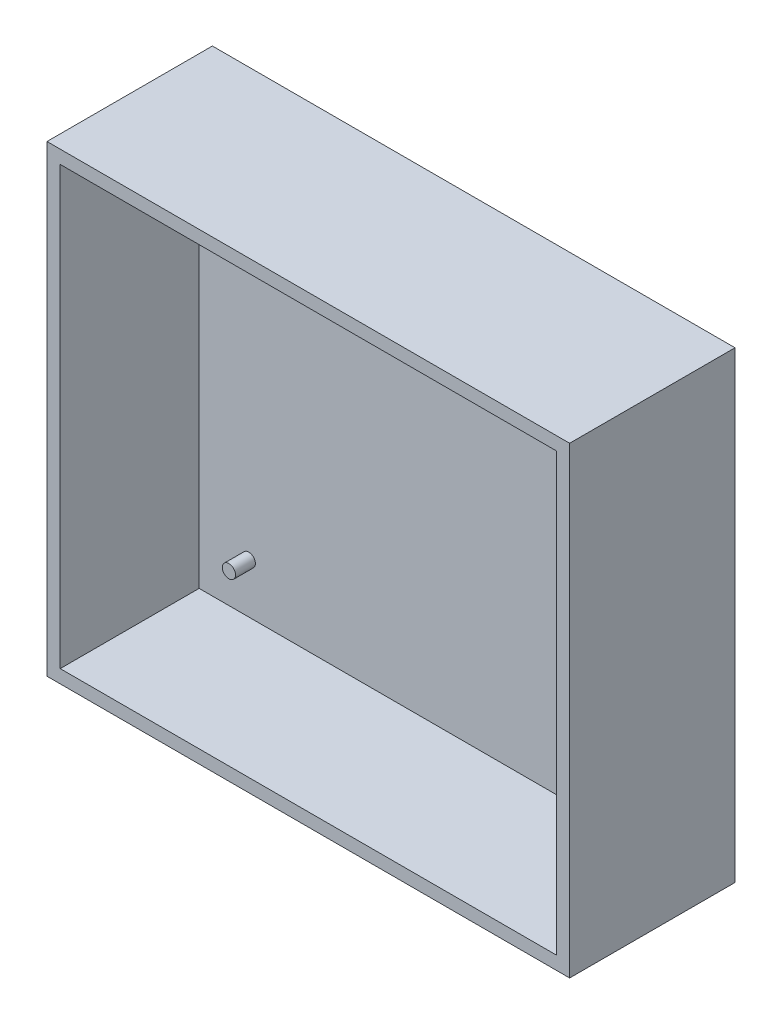
ISO-10303-21;
HEADER;
FILE_DESCRIPTION(('STEP AP214'),'2;1');
FILE_NAME('part.step','',(''),(''),'','','');
FILE_SCHEMA(('AUTOMOTIVE_DESIGN { 1 0 10303 214 1 1 1 1 }'));
ENDSEC;
DATA;
#1=APPLICATION_CONTEXT('core data for automotive mechanical design processes');
#2=APPLICATION_PROTOCOL_DEFINITION('international standard','automotive_design',2000,#1);
#3=PRODUCT_CONTEXT('',#1,'mechanical');
#4=PRODUCT('Part','Part','',(#3));
#5=PRODUCT_RELATED_PRODUCT_CATEGORY('part','',(#4));
#6=PRODUCT_DEFINITION_FORMATION('','',#4);
#7=PRODUCT_DEFINITION_CONTEXT('part definition',#1,'design');
#8=PRODUCT_DEFINITION('design','',#6,#7);
#9=PRODUCT_DEFINITION_SHAPE('','',#8);
#10=(LENGTH_UNIT() NAMED_UNIT(*) SI_UNIT(.MILLI.,.METRE.));
#11=(NAMED_UNIT(*) PLANE_ANGLE_UNIT() SI_UNIT($,.RADIAN.));
#12=(NAMED_UNIT(*) SI_UNIT($,.STERADIAN.) SOLID_ANGLE_UNIT());
#13=UNCERTAINTY_MEASURE_WITH_UNIT(LENGTH_MEASURE(1.E-05),#10,'distance_accuracy_value','');
#14=(GEOMETRIC_REPRESENTATION_CONTEXT(3) GLOBAL_UNCERTAINTY_ASSIGNED_CONTEXT((#13)) GLOBAL_UNIT_ASSIGNED_CONTEXT((#10,
#11,#12)) REPRESENTATION_CONTEXT('',''));
#15=CARTESIAN_POINT('',(0.,0.,0.));
#16=DIRECTION('',(0.,0.,1.));
#17=DIRECTION('',(1.,0.,0.));
#18=AXIS2_PLACEMENT_3D('',#15,#16,#17);
#19=CARTESIAN_POINT('',(0.,0.,4.));
#20=DIRECTION('',(0.,0.,-1.));
#21=DIRECTION('',(-1.,0.,0.));
#22=AXIS2_PLACEMENT_3D('',#19,#20,#21);
#23=PLANE('',#22);
#24=CARTESIAN_POINT('',(7.49999999999999,7.5,4.));
#25=DIRECTION('',(0.,0.,-1.));
#26=DIRECTION('',(-1.,0.,0.));
#27=AXIS2_PLACEMENT_3D('',#24,#25,#26);
#28=CIRCLE('',#27,0.999999999999998);
#29=CARTESIAN_POINT('',(6.49999999999999,7.5,4.));
#30=VERTEX_POINT('',#29);
#31=EDGE_CURVE('E11',#30,#30,#28,.F.);
#32=ORIENTED_EDGE('',*,*,#31,.F.);
#33=EDGE_LOOP('',(#32));
#34=FACE_BOUND('',#33,.T.);
#35=CARTESIAN_POINT('',(7.49999999999999,58.5,4.));
#36=DIRECTION('',(0.,0.,-1.));
#37=DIRECTION('',(-1.,0.,0.));
#38=AXIS2_PLACEMENT_3D('',#35,#36,#37);
#39=CIRCLE('',#38,0.999999999999998);
#40=CARTESIAN_POINT('',(6.49999999999999,58.5,4.));
#41=VERTEX_POINT('',#40);
#42=EDGE_CURVE('E41',#41,#41,#39,.F.);
#43=ORIENTED_EDGE('',*,*,#42,.F.);
#44=EDGE_LOOP('',(#43));
#45=FACE_BOUND('',#44,.T.);
#46=CARTESIAN_POINT('',(67.5,58.5,4.));
#47=DIRECTION('',(0.,0.,-1.));
#48=DIRECTION('',(-1.,0.,0.));
#49=AXIS2_PLACEMENT_3D('',#46,#47,#48);
#50=CIRCLE('',#49,0.999999999999998);
#51=CARTESIAN_POINT('',(66.5,58.5,4.));
#52=VERTEX_POINT('',#51);
#53=EDGE_CURVE('E183',#52,#52,#50,.F.);
#54=ORIENTED_EDGE('',*,*,#53,.F.);
#55=EDGE_LOOP('',(#54));
#56=FACE_BOUND('',#55,.T.);
#57=CARTESIAN_POINT('',(67.5,7.5,4.));
#58=DIRECTION('',(0.,0.,-1.));
#59=DIRECTION('',(-1.,0.,0.));
#60=AXIS2_PLACEMENT_3D('',#57,#58,#59);
#61=CIRCLE('',#60,0.999999999999998);
#62=CARTESIAN_POINT('',(66.5,7.5,4.));
#63=VERTEX_POINT('',#62);
#64=EDGE_CURVE('E180',#63,#63,#61,.F.);
#65=ORIENTED_EDGE('',*,*,#64,.F.);
#66=EDGE_LOOP('',(#65));
#67=FACE_BOUND('',#66,.T.);
#68=DIRECTION('',(0.,-1.,0.));
#69=VECTOR('',#68,1.);
#70=CARTESIAN_POINT('',(0.,0.,4.));
#71=LINE('',#70,#69);
#72=CARTESIAN_POINT('',(0.,66.,4.));
#73=VERTEX_POINT('',#72);
#74=CARTESIAN_POINT('',(0.,0.,4.));
#75=VERTEX_POINT('',#74);
#76=EDGE_CURVE('E173',#73,#75,#71,.T.);
#77=ORIENTED_EDGE('',*,*,#76,.T.);
#78=DIRECTION('',(1.,0.,0.));
#79=VECTOR('',#78,1.);
#80=CARTESIAN_POINT('',(0.,0.,4.));
#81=LINE('',#80,#79);
#82=CARTESIAN_POINT('',(75.,0.,4.));
#83=VERTEX_POINT('',#82);
#84=EDGE_CURVE('E103',#75,#83,#81,.T.);
#85=ORIENTED_EDGE('',*,*,#84,.T.);
#86=DIRECTION('',(0.,1.,0.));
#87=VECTOR('',#86,1.);
#88=CARTESIAN_POINT('',(75.,0.,4.));
#89=LINE('',#88,#87);
#90=CARTESIAN_POINT('',(75.,66.,4.));
#91=VERTEX_POINT('',#90);
#92=EDGE_CURVE('E56',#83,#91,#89,.T.);
#93=ORIENTED_EDGE('',*,*,#92,.T.);
#94=DIRECTION('',(-1.,0.,0.));
#95=VECTOR('',#94,1.);
#96=CARTESIAN_POINT('',(0.,66.,4.));
#97=LINE('',#96,#95);
#98=EDGE_CURVE('E177',#91,#73,#97,.T.);
#99=ORIENTED_EDGE('',*,*,#98,.T.);
#100=EDGE_LOOP('',(#77,#85,#93,#99));
#101=FACE_BOUND('',#100,.T.);
#102=ADVANCED_FACE('F33',(#34,#45,#56,#67,#101),#23,.F.);
#103=CARTESIAN_POINT('',(67.5,7.5,7.));
#104=DIRECTION('',(0.,0.,-1.));
#105=DIRECTION('',(-1.,0.,0.));
#106=AXIS2_PLACEMENT_3D('',#103,#104,#105);
#107=CYLINDRICAL_SURFACE('',#106,0.999999999999998);
#108=CARTESIAN_POINT('',(67.5,7.5,7.));
#109=DIRECTION('',(0.,0.,1.));
#110=DIRECTION('',(1.,0.,0.));
#111=AXIS2_PLACEMENT_3D('',#108,#109,#110);
#112=CIRCLE('',#111,0.999999999999998);
#113=CARTESIAN_POINT('',(68.5,7.5,7.));
#114=VERTEX_POINT('',#113);
#115=EDGE_CURVE('E170',#114,#114,#112,.T.);
#116=ORIENTED_EDGE('',*,*,#115,.F.);
#117=EDGE_LOOP('',(#116));
#118=FACE_BOUND('',#117,.T.);
#119=ORIENTED_EDGE('',*,*,#64,.T.);
#120=EDGE_LOOP('',(#119));
#121=FACE_BOUND('',#120,.T.);
#122=ADVANCED_FACE('F192',(#118,#121),#107,.T.);
#123=CARTESIAN_POINT('',(67.5,7.5,7.));
#124=DIRECTION('',(0.,0.,1.));
#125=DIRECTION('',(1.,0.,0.));
#126=AXIS2_PLACEMENT_3D('',#123,#124,#125);
#127=PLANE('',#126);
#128=ORIENTED_EDGE('',*,*,#115,.T.);
#129=EDGE_LOOP('',(#128));
#130=FACE_BOUND('',#129,.T.);
#131=ADVANCED_FACE('F252',(#130),#127,.T.);
#132=CARTESIAN_POINT('',(67.5,58.5,7.));
#133=DIRECTION('',(0.,0.,-1.));
#134=DIRECTION('',(-1.,0.,0.));
#135=AXIS2_PLACEMENT_3D('',#132,#133,#134);
#136=CYLINDRICAL_SURFACE('',#135,0.999999999999998);
#137=CARTESIAN_POINT('',(67.5,58.5,7.));
#138=DIRECTION('',(0.,0.,1.));
#139=DIRECTION('',(-1.,0.,0.));
#140=AXIS2_PLACEMENT_3D('',#137,#138,#139);
#141=CIRCLE('',#140,0.999999999999998);
#142=CARTESIAN_POINT('',(66.5,58.5,7.));
#143=VERTEX_POINT('',#142);
#144=EDGE_CURVE('E167',#143,#143,#141,.T.);
#145=ORIENTED_EDGE('',*,*,#144,.F.);
#146=EDGE_LOOP('',(#145));
#147=FACE_BOUND('',#146,.T.);
#148=ORIENTED_EDGE('',*,*,#53,.T.);
#149=EDGE_LOOP('',(#148));
#150=FACE_BOUND('',#149,.T.);
#151=ADVANCED_FACE('F248',(#147,#150),#136,.T.);
#152=CARTESIAN_POINT('',(67.5,58.5,7.));
#153=DIRECTION('',(0.,0.,-1.));
#154=DIRECTION('',(-1.,0.,0.));
#155=AXIS2_PLACEMENT_3D('',#152,#153,#154);
#156=PLANE('',#155);
#157=ORIENTED_EDGE('',*,*,#144,.T.);
#158=EDGE_LOOP('',(#157));
#159=FACE_BOUND('',#158,.T.);
#160=ADVANCED_FACE('F244',(#159),#156,.F.);
#161=CARTESIAN_POINT('',(7.49999999999999,58.5,7.));
#162=DIRECTION('',(0.,0.,-1.));
#163=DIRECTION('',(-1.,0.,0.));
#164=AXIS2_PLACEMENT_3D('',#161,#162,#163);
#165=CYLINDRICAL_SURFACE('',#164,0.999999999999998);
#166=CARTESIAN_POINT('',(7.49999999999999,58.5,7.));
#167=DIRECTION('',(0.,0.,1.));
#168=DIRECTION('',(1.,0.,0.));
#169=AXIS2_PLACEMENT_3D('',#166,#167,#168);
#170=CIRCLE('',#169,0.999999999999998);
#171=CARTESIAN_POINT('',(8.49999999999999,58.5,7.));
#172=VERTEX_POINT('',#171);
#173=EDGE_CURVE('E164',#172,#172,#170,.T.);
#174=ORIENTED_EDGE('',*,*,#173,.F.);
#175=EDGE_LOOP('',(#174));
#176=FACE_BOUND('',#175,.T.);
#177=ORIENTED_EDGE('',*,*,#42,.T.);
#178=EDGE_LOOP('',(#177));
#179=FACE_BOUND('',#178,.T.);
#180=ADVANCED_FACE('F188',(#176,#179),#165,.T.);
#181=CARTESIAN_POINT('',(7.49999999999999,58.5,7.));
#182=DIRECTION('',(0.,0.,1.));
#183=DIRECTION('',(1.,0.,0.));
#184=AXIS2_PLACEMENT_3D('',#181,#182,#183);
#185=PLANE('',#184);
#186=ORIENTED_EDGE('',*,*,#173,.T.);
#187=EDGE_LOOP('',(#186));
#188=FACE_BOUND('',#187,.T.);
#189=ADVANCED_FACE('F237',(#188),#185,.T.);
#190=CARTESIAN_POINT('',(7.49999999999999,7.5,7.));
#191=DIRECTION('',(0.,0.,-1.));
#192=DIRECTION('',(-1.,0.,0.));
#193=AXIS2_PLACEMENT_3D('',#190,#191,#192);
#194=CYLINDRICAL_SURFACE('',#193,0.999999999999998);
#195=CARTESIAN_POINT('',(7.49999999999999,7.5,7.));
#196=DIRECTION('',(0.,0.,1.));
#197=DIRECTION('',(-1.,0.,0.));
#198=AXIS2_PLACEMENT_3D('',#195,#196,#197);
#199=CIRCLE('',#198,0.999999999999998);
#200=CARTESIAN_POINT('',(6.49999999999999,7.5,7.));
#201=VERTEX_POINT('',#200);
#202=EDGE_CURVE('E156',#201,#201,#199,.T.);
#203=ORIENTED_EDGE('',*,*,#202,.F.);
#204=EDGE_LOOP('',(#203));
#205=FACE_BOUND('',#204,.T.);
#206=ORIENTED_EDGE('',*,*,#31,.T.);
#207=EDGE_LOOP('',(#206));
#208=FACE_BOUND('',#207,.T.);
#209=ADVANCED_FACE('F233',(#205,#208),#194,.T.);
#210=CARTESIAN_POINT('',(7.49999999999999,7.5,7.));
#211=DIRECTION('',(0.,0.,-1.));
#212=DIRECTION('',(-1.,0.,0.));
#213=AXIS2_PLACEMENT_3D('',#210,#211,#212);
#214=PLANE('',#213);
#215=ORIENTED_EDGE('',*,*,#202,.T.);
#216=EDGE_LOOP('',(#215));
#217=FACE_BOUND('',#216,.T.);
#218=ADVANCED_FACE('F208',(#217),#214,.F.);
#219=CARTESIAN_POINT('',(75.,0.,25.));
#220=DIRECTION('',(0.,-1.,0.));
#221=DIRECTION('',(0.,0.,-1.));
#222=AXIS2_PLACEMENT_3D('',#219,#220,#221);
#223=PLANE('',#222);
#224=DIRECTION('',(0.,0.,-1.));
#225=VECTOR('',#224,1.);
#226=CARTESIAN_POINT('',(75.,0.,25.));
#227=LINE('',#226,#225);
#228=CARTESIAN_POINT('',(75.,0.,25.));
#229=VERTEX_POINT('',#228);
#230=EDGE_CURVE('E124',#229,#83,#227,.T.);
#231=ORIENTED_EDGE('',*,*,#230,.T.);
#232=ORIENTED_EDGE('',*,*,#84,.F.);
#233=DIRECTION('',(0.,0.,-1.));
#234=VECTOR('',#233,1.);
#235=CARTESIAN_POINT('',(0.,0.,25.));
#236=LINE('',#235,#234);
#237=CARTESIAN_POINT('',(0.,0.,25.));
#238=VERTEX_POINT('',#237);
#239=EDGE_CURVE('E48',#238,#75,#236,.T.);
#240=ORIENTED_EDGE('',*,*,#239,.F.);
#241=DIRECTION('',(-1.,0.,0.));
#242=VECTOR('',#241,1.);
#243=CARTESIAN_POINT('',(75.,0.,25.));
#244=LINE('',#243,#242);
#245=EDGE_CURVE('E100',#229,#238,#244,.T.);
#246=ORIENTED_EDGE('',*,*,#245,.F.);
#247=EDGE_LOOP('',(#231,#232,#240,#246));
#248=FACE_BOUND('',#247,.T.);
#249=ADVANCED_FACE('F98',(#248),#223,.F.);
#250=CARTESIAN_POINT('',(75.,66.,25.));
#251=DIRECTION('',(1.,0.,0.));
#252=DIRECTION('',(0.,0.,-1.));
#253=AXIS2_PLACEMENT_3D('',#250,#251,#252);
#254=PLANE('',#253);
#255=DIRECTION('',(0.,0.,-1.));
#256=VECTOR('',#255,1.);
#257=CARTESIAN_POINT('',(75.,66.,25.));
#258=LINE('',#257,#256);
#259=CARTESIAN_POINT('',(75.,66.,25.));
#260=VERTEX_POINT('',#259);
#261=EDGE_CURVE('E127',#260,#91,#258,.T.);
#262=ORIENTED_EDGE('',*,*,#261,.T.);
#263=ORIENTED_EDGE('',*,*,#92,.F.);
#264=ORIENTED_EDGE('',*,*,#230,.F.);
#265=DIRECTION('',(0.,-1.,0.));
#266=VECTOR('',#265,1.);
#267=CARTESIAN_POINT('',(75.,66.,25.));
#268=LINE('',#267,#266);
#269=EDGE_CURVE('E106',#260,#229,#268,.T.);
#270=ORIENTED_EDGE('',*,*,#269,.F.);
#271=EDGE_LOOP('',(#262,#263,#264,#270));
#272=FACE_BOUND('',#271,.T.);
#273=ADVANCED_FACE('F200',(#272),#254,.F.);
#274=CARTESIAN_POINT('',(0.,66.,25.));
#275=DIRECTION('',(0.,1.,0.));
#276=DIRECTION('',(0.,0.,1.));
#277=AXIS2_PLACEMENT_3D('',#274,#275,#276);
#278=PLANE('',#277);
#279=DIRECTION('',(0.,0.,-1.));
#280=VECTOR('',#279,1.);
#281=CARTESIAN_POINT('',(0.,66.,25.));
#282=LINE('',#281,#280);
#283=CARTESIAN_POINT('',(0.,66.,25.));
#284=VERTEX_POINT('',#283);
#285=EDGE_CURVE('E105',#284,#73,#282,.T.);
#286=ORIENTED_EDGE('',*,*,#285,.T.);
#287=ORIENTED_EDGE('',*,*,#98,.F.);
#288=ORIENTED_EDGE('',*,*,#261,.F.);
#289=DIRECTION('',(1.,0.,0.));
#290=VECTOR('',#289,1.);
#291=CARTESIAN_POINT('',(0.,66.,25.));
#292=LINE('',#291,#290);
#293=EDGE_CURVE('E115',#284,#260,#292,.T.);
#294=ORIENTED_EDGE('',*,*,#293,.F.);
#295=EDGE_LOOP('',(#286,#287,#288,#294));
#296=FACE_BOUND('',#295,.T.);
#297=ADVANCED_FACE('F199',(#296),#278,.F.);
#298=CARTESIAN_POINT('',(0.,0.,25.));
#299=DIRECTION('',(-1.,0.,0.));
#300=DIRECTION('',(0.,0.,1.));
#301=AXIS2_PLACEMENT_3D('',#298,#299,#300);
#302=PLANE('',#301);
#303=ORIENTED_EDGE('',*,*,#239,.T.);
#304=ORIENTED_EDGE('',*,*,#76,.F.);
#305=ORIENTED_EDGE('',*,*,#285,.F.);
#306=DIRECTION('',(0.,1.,0.));
#307=VECTOR('',#306,1.);
#308=CARTESIAN_POINT('',(0.,0.,25.));
#309=LINE('',#308,#307);
#310=EDGE_CURVE('E110',#238,#284,#309,.T.);
#311=ORIENTED_EDGE('',*,*,#310,.F.);
#312=EDGE_LOOP('',(#303,#304,#305,#311));
#313=FACE_BOUND('',#312,.T.);
#314=ADVANCED_FACE('F111',(#313),#302,.F.);
#315=CARTESIAN_POINT('',(77.,-2.,25.));
#316=DIRECTION('',(0.,-1.,0.));
#317=DIRECTION('',(0.,0.,-1.));
#318=AXIS2_PLACEMENT_3D('',#315,#316,#317);
#319=PLANE('',#318);
#320=DIRECTION('',(-1.,0.,0.));
#321=VECTOR('',#320,1.);
#322=CARTESIAN_POINT('',(77.,-2.,0.));
#323=LINE('',#322,#321);
#324=CARTESIAN_POINT('',(77.,-2.,0.));
#325=VERTEX_POINT('',#324);
#326=CARTESIAN_POINT('',(-2.,-2.,0.));
#327=VERTEX_POINT('',#326);
#328=EDGE_CURVE('E126',#325,#327,#323,.T.);
#329=ORIENTED_EDGE('',*,*,#328,.F.);
#330=DIRECTION('',(0.,0.,-1.));
#331=VECTOR('',#330,1.);
#332=CARTESIAN_POINT('',(77.,-2.,25.));
#333=LINE('',#332,#331);
#334=CARTESIAN_POINT('',(77.,-2.,25.));
#335=VERTEX_POINT('',#334);
#336=EDGE_CURVE('E154',#335,#325,#333,.T.);
#337=ORIENTED_EDGE('',*,*,#336,.F.);
#338=DIRECTION('',(-1.,0.,0.));
#339=VECTOR('',#338,1.);
#340=CARTESIAN_POINT('',(77.,-2.,25.));
#341=LINE('',#340,#339);
#342=CARTESIAN_POINT('',(-2.,-2.,25.));
#343=VERTEX_POINT('',#342);
#344=EDGE_CURVE('E130',#335,#343,#341,.T.);
#345=ORIENTED_EDGE('',*,*,#344,.T.);
#346=DIRECTION('',(0.,0.,-1.));
#347=VECTOR('',#346,1.);
#348=CARTESIAN_POINT('',(-2.,-2.,25.));
#349=LINE('',#348,#347);
#350=EDGE_CURVE('E143',#343,#327,#349,.T.);
#351=ORIENTED_EDGE('',*,*,#350,.T.);
#352=EDGE_LOOP('',(#329,#337,#345,#351));
#353=FACE_BOUND('',#352,.T.);
#354=ADVANCED_FACE('F212',(#353),#319,.T.);
#355=CARTESIAN_POINT('',(77.,68.,25.));
#356=DIRECTION('',(1.,0.,0.));
#357=DIRECTION('',(0.,0.,-1.));
#358=AXIS2_PLACEMENT_3D('',#355,#356,#357);
#359=PLANE('',#358);
#360=DIRECTION('',(0.,-1.,0.));
#361=VECTOR('',#360,1.);
#362=CARTESIAN_POINT('',(77.,68.,0.));
#363=LINE('',#362,#361);
#364=CARTESIAN_POINT('',(77.,68.,0.));
#365=VERTEX_POINT('',#364);
#366=EDGE_CURVE('E134',#365,#325,#363,.T.);
#367=ORIENTED_EDGE('',*,*,#366,.F.);
#368=DIRECTION('',(0.,0.,-1.));
#369=VECTOR('',#368,1.);
#370=CARTESIAN_POINT('',(77.,68.,25.));
#371=LINE('',#370,#369);
#372=CARTESIAN_POINT('',(77.,68.,25.));
#373=VERTEX_POINT('',#372);
#374=EDGE_CURVE('E157',#373,#365,#371,.T.);
#375=ORIENTED_EDGE('',*,*,#374,.F.);
#376=DIRECTION('',(0.,-1.,0.));
#377=VECTOR('',#376,1.);
#378=CARTESIAN_POINT('',(77.,68.,25.));
#379=LINE('',#378,#377);
#380=EDGE_CURVE('E140',#373,#335,#379,.T.);
#381=ORIENTED_EDGE('',*,*,#380,.T.);
#382=ORIENTED_EDGE('',*,*,#336,.T.);
#383=EDGE_LOOP('',(#367,#375,#381,#382));
#384=FACE_BOUND('',#383,.T.);
#385=ADVANCED_FACE('F217',(#384),#359,.T.);
#386=CARTESIAN_POINT('',(-2.,68.,25.));
#387=DIRECTION('',(0.,1.,0.));
#388=DIRECTION('',(0.,0.,1.));
#389=AXIS2_PLACEMENT_3D('',#386,#387,#388);
#390=PLANE('',#389);
#391=DIRECTION('',(1.,0.,0.));
#392=VECTOR('',#391,1.);
#393=CARTESIAN_POINT('',(-2.,68.,0.));
#394=LINE('',#393,#392);
#395=CARTESIAN_POINT('',(-2.,68.,0.));
#396=VERTEX_POINT('',#395);
#397=EDGE_CURVE('E149',#396,#365,#394,.T.);
#398=ORIENTED_EDGE('',*,*,#397,.F.);
#399=DIRECTION('',(0.,0.,-1.));
#400=VECTOR('',#399,1.);
#401=CARTESIAN_POINT('',(-2.,68.,25.));
#402=LINE('',#401,#400);
#403=CARTESIAN_POINT('',(-2.,68.,25.));
#404=VERTEX_POINT('',#403);
#405=EDGE_CURVE('E159',#404,#396,#402,.T.);
#406=ORIENTED_EDGE('',*,*,#405,.F.);
#407=DIRECTION('',(1.,0.,0.));
#408=VECTOR('',#407,1.);
#409=CARTESIAN_POINT('',(-2.,68.,25.));
#410=LINE('',#409,#408);
#411=EDGE_CURVE('E137',#404,#373,#410,.T.);
#412=ORIENTED_EDGE('',*,*,#411,.T.);
#413=ORIENTED_EDGE('',*,*,#374,.T.);
#414=EDGE_LOOP('',(#398,#406,#412,#413));
#415=FACE_BOUND('',#414,.T.);
#416=ADVANCED_FACE('F220',(#415),#390,.T.);
#417=CARTESIAN_POINT('',(-2.,-2.,25.));
#418=DIRECTION('',(-1.,0.,0.));
#419=DIRECTION('',(0.,0.,1.));
#420=AXIS2_PLACEMENT_3D('',#417,#418,#419);
#421=PLANE('',#420);
#422=DIRECTION('',(0.,1.,0.));
#423=VECTOR('',#422,1.);
#424=CARTESIAN_POINT('',(-2.,-2.,0.));
#425=LINE('',#424,#423);
#426=EDGE_CURVE('E146',#327,#396,#425,.T.);
#427=ORIENTED_EDGE('',*,*,#426,.F.);
#428=ORIENTED_EDGE('',*,*,#350,.F.);
#429=DIRECTION('',(0.,1.,0.));
#430=VECTOR('',#429,1.);
#431=CARTESIAN_POINT('',(-2.,-2.,25.));
#432=LINE('',#431,#430);
#433=EDGE_CURVE('E133',#343,#404,#432,.T.);
#434=ORIENTED_EDGE('',*,*,#433,.T.);
#435=ORIENTED_EDGE('',*,*,#405,.T.);
#436=EDGE_LOOP('',(#427,#428,#434,#435));
#437=FACE_BOUND('',#436,.T.);
#438=ADVANCED_FACE('F216',(#437),#421,.T.);
#439=CARTESIAN_POINT('',(0.,0.,25.));
#440=DIRECTION('',(0.,0.,-1.));
#441=DIRECTION('',(-1.,0.,0.));
#442=AXIS2_PLACEMENT_3D('',#439,#440,#441);
#443=PLANE('',#442);
#444=ORIENTED_EDGE('',*,*,#269,.T.);
#445=ORIENTED_EDGE('',*,*,#245,.T.);
#446=ORIENTED_EDGE('',*,*,#310,.T.);
#447=ORIENTED_EDGE('',*,*,#293,.T.);
#448=EDGE_LOOP('',(#444,#445,#446,#447));
#449=FACE_BOUND('',#448,.T.);
#450=ORIENTED_EDGE('',*,*,#344,.F.);
#451=ORIENTED_EDGE('',*,*,#380,.F.);
#452=ORIENTED_EDGE('',*,*,#411,.F.);
#453=ORIENTED_EDGE('',*,*,#433,.F.);
#454=EDGE_LOOP('',(#450,#451,#452,#453));
#455=FACE_BOUND('',#454,.T.);
#456=ADVANCED_FACE('F117',(#449,#455),#443,.F.);
#457=CARTESIAN_POINT('',(0.,0.,0.));
#458=DIRECTION('',(0.,0.,-1.));
#459=DIRECTION('',(-1.,0.,0.));
#460=AXIS2_PLACEMENT_3D('',#457,#458,#459);
#461=PLANE('',#460);
#462=ORIENTED_EDGE('',*,*,#328,.T.);
#463=ORIENTED_EDGE('',*,*,#426,.T.);
#464=ORIENTED_EDGE('',*,*,#397,.T.);
#465=ORIENTED_EDGE('',*,*,#366,.T.);
#466=EDGE_LOOP('',(#462,#463,#464,#465));
#467=FACE_BOUND('',#466,.T.);
#468=ADVANCED_FACE('F35',(#467),#461,.T.);
#469=CLOSED_SHELL('',(#102,#122,#131,#151,#160,#180,#189,#209,#218,#249,#273,#297,#314,#354,
#385,#416,#438,#456,#468));
#470=MANIFOLD_SOLID_BREP('B2',#469);
#471=ADVANCED_BREP_SHAPE_REPRESENTATION('',(#18,#470),#14);
#472=SHAPE_DEFINITION_REPRESENTATION(#9,#471);
ENDSEC;
END-ISO-10303-21;
